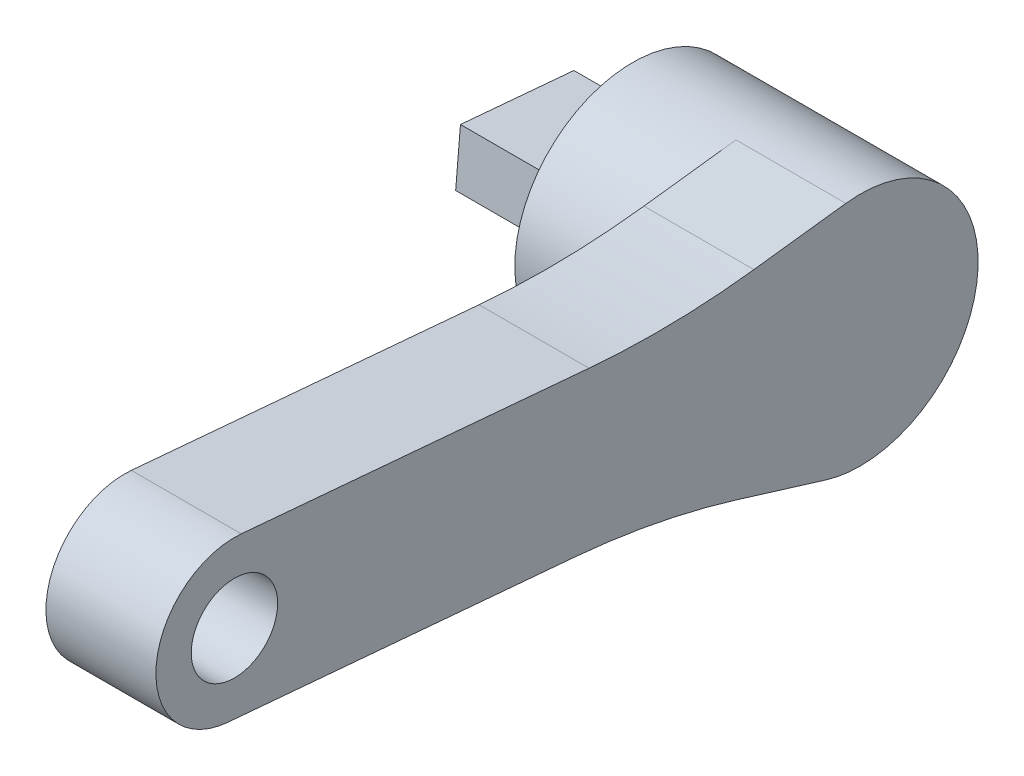
ISO-10303-21;
HEADER;
FILE_DESCRIPTION(('STEP AP214'),'2;1');
FILE_NAME('part.step','',(''),(''),'','','');
FILE_SCHEMA(('AUTOMOTIVE_DESIGN { 1 0 10303 214 1 1 1 1 }'));
ENDSEC;
DATA;
#1=APPLICATION_CONTEXT('core data for automotive mechanical design processes');
#2=APPLICATION_PROTOCOL_DEFINITION('international standard','automotive_design',2000,#1);
#3=PRODUCT_CONTEXT('',#1,'mechanical');
#4=PRODUCT('Part','Part','',(#3));
#5=PRODUCT_RELATED_PRODUCT_CATEGORY('part','',(#4));
#6=PRODUCT_DEFINITION_FORMATION('','',#4);
#7=PRODUCT_DEFINITION_CONTEXT('part definition',#1,'design');
#8=PRODUCT_DEFINITION('design','',#6,#7);
#9=PRODUCT_DEFINITION_SHAPE('','',#8);
#10=(LENGTH_UNIT() NAMED_UNIT(*) SI_UNIT(.MILLI.,.METRE.));
#11=(NAMED_UNIT(*) PLANE_ANGLE_UNIT() SI_UNIT($,.RADIAN.));
#12=(NAMED_UNIT(*) SI_UNIT($,.STERADIAN.) SOLID_ANGLE_UNIT());
#13=UNCERTAINTY_MEASURE_WITH_UNIT(LENGTH_MEASURE(1.E-05),#10,'distance_accuracy_value','');
#14=(GEOMETRIC_REPRESENTATION_CONTEXT(3) GLOBAL_UNCERTAINTY_ASSIGNED_CONTEXT((#13)) GLOBAL_UNIT_ASSIGNED_CONTEXT((#10,
#11,#12)) REPRESENTATION_CONTEXT('',''));
#15=CARTESIAN_POINT('',(0.,0.,0.));
#16=DIRECTION('',(0.,0.,1.));
#17=DIRECTION('',(1.,0.,0.));
#18=AXIS2_PLACEMENT_3D('',#15,#16,#17);
#19=CARTESIAN_POINT('',(17.,-57.9290572909012,5.01653247030481));
#20=DIRECTION('',(-1.,0.,0.));
#21=DIRECTION('',(0.,0.,1.));
#22=AXIS2_PLACEMENT_3D('',#19,#20,#21);
#23=PLANE('',#22);
#24=CARTESIAN_POINT('',(17.,-56.5345654069388,20.9556476397727));
#25=DIRECTION('',(-1.,0.,0.));
#26=DIRECTION('',(0.,0.,1.));
#27=AXIS2_PLACEMENT_3D('',#24,#25,#26);
#28=CIRCLE('',#27,1.09999999999999);
#29=CARTESIAN_POINT('',(17.,-56.5345654069388,22.0556476397727));
#30=VERTEX_POINT('',#29);
#31=EDGE_CURVE('E314',#30,#30,#28,.T.);
#32=ORIENTED_EDGE('',*,*,#31,.F.);
#33=EDGE_LOOP('',(#32));
#34=FACE_BOUND('',#33,.T.);
#35=CARTESIAN_POINT('',(17.,-57.9290572909012,5.01653247030481));
#36=DIRECTION('',(-1.,0.,0.));
#37=DIRECTION('',(0.,0.,1.));
#38=AXIS2_PLACEMENT_3D('',#35,#36,#37);
#39=CIRCLE('',#38,2.99999999999923);
#40=CARTESIAN_POINT('',(17.,-60.7971573612365,5.89630629723257));
#41=VERTEX_POINT('',#40);
#42=CARTESIAN_POINT('',(17.,-54.9517589834166,5.38490020538022));
#43=VERTEX_POINT('',#42);
#44=EDGE_CURVE('E12',#41,#43,#39,.T.);
#45=ORIENTED_EDGE('',*,*,#44,.F.);
#46=DIRECTION('',(0.,-0.293257942309178,-0.956033356778197));
#47=VECTOR('',#46,1.);
#48=CARTESIAN_POINT('',(17.,-59.4856679733464,10.1718174462596));
#49=LINE('',#48,#47);
#50=CARTESIAN_POINT('',(17.,-60.1048692679701,8.15319490680121));
#51=VERTEX_POINT('',#50);
#52=EDGE_CURVE('E166',#51,#41,#49,.T.);
#53=ORIENTED_EDGE('',*,*,#52,.F.);
#54=CARTESIAN_POINT('',(17.,-79.225536403534,14.0183537529848));
#55=DIRECTION('',(-1.,0.,0.));
#56=DIRECTION('',(0.,0.,1.));
#57=AXIS2_PLACEMENT_3D('',#54,#55,#56);
#58=CIRCLE('',#57,20.);
#59=CARTESIAN_POINT('',(17.,-59.3016424416991,12.2752388980318));
#60=VERTEX_POINT('',#59);
#61=EDGE_CURVE('E52',#51,#60,#58,.F.);
#62=ORIENTED_EDGE('',*,*,#61,.T.);
#63=DIRECTION('',(0.,-0.0871557427476503,-0.996194698091746));
#64=VECTOR('',#63,1.);
#65=CARTESIAN_POINT('',(17.,-59.4856679733464,10.1718174462596));
#66=LINE('',#65,#64);
#67=CARTESIAN_POINT('',(17.,-58.5269548031223,21.1299591252681));
#68=VERTEX_POINT('',#67);
#69=EDGE_CURVE('E182',#68,#60,#66,.T.);
#70=ORIENTED_EDGE('',*,*,#69,.F.);
#71=CARTESIAN_POINT('',(17.,-56.5345654069388,20.9556476397727));
#72=DIRECTION('',(-1.,0.,0.));
#73=DIRECTION('',(0.,0.,1.));
#74=AXIS2_PLACEMENT_3D('',#71,#72,#73);
#75=CIRCLE('',#74,2.00000000000001);
#76=CARTESIAN_POINT('',(17.,-54.5421760107553,20.7813361542774));
#77=VERTEX_POINT('',#76);
#78=EDGE_CURVE('E187',#77,#68,#75,.F.);
#79=ORIENTED_EDGE('',*,*,#78,.F.);
#80=DIRECTION('',(0.,0.0871557427476509,0.996194698091746));
#81=VECTOR('',#80,1.);
#82=CARTESIAN_POINT('',(17.,-54.5421760107553,20.7813361542774));
#83=LINE('',#82,#81);
#84=CARTESIAN_POINT('',(17.,-55.3168636493321,11.9266159270411));
#85=VERTEX_POINT('',#84);
#86=EDGE_CURVE('E191',#85,#77,#83,.T.);
#87=ORIENTED_EDGE('',*,*,#86,.F.);
#88=CARTESIAN_POINT('',(17.,-35.3929696874971,10.1835010720881));
#89=DIRECTION('',(-1.,0.,0.));
#90=DIRECTION('',(0.,0.,1.));
#91=AXIS2_PLACEMENT_3D('',#88,#89,#90);
#92=CIRCLE('',#91,20.);
#93=CARTESIAN_POINT('',(17.,-55.2416250707331,7.72771617158475));
#94=VERTEX_POINT('',#93);
#95=EDGE_CURVE('E214',#85,#94,#92,.F.);
#96=ORIENTED_EDGE('',*,*,#95,.T.);
#97=DIRECTION('',(0.,-0.122789245025168,0.992432769161795));
#98=VECTOR('',#97,1.);
#99=CARTESIAN_POINT('',(17.,-55.5008891809794,9.82319447526902));
#100=LINE('',#99,#98);
#101=EDGE_CURVE('E193',#43,#94,#100,.T.);
#102=ORIENTED_EDGE('',*,*,#101,.F.);
#103=EDGE_LOOP('',(#45,#53,#62,#70,#79,#87,#96,#102));
#104=FACE_BOUND('',#103,.T.);
#105=ADVANCED_FACE('F43',(#34,#104),#23,.T.);
#106=CARTESIAN_POINT('',(19.8,-56.5345654069388,20.9556476397727));
#107=DIRECTION('',(1.,0.,0.));
#108=DIRECTION('',(0.,0.,-1.));
#109=AXIS2_PLACEMENT_3D('',#106,#107,#108);
#110=PLANE('',#109);
#111=CARTESIAN_POINT('',(19.8,-56.5345654069388,20.9556476397727));
#112=DIRECTION('',(1.,0.,0.));
#113=DIRECTION('',(0.,0.,-1.));
#114=AXIS2_PLACEMENT_3D('',#111,#112,#113);
#115=CIRCLE('',#114,1.09999999999999);
#116=CARTESIAN_POINT('',(19.8,-56.5345654069388,19.8556476397728));
#117=VERTEX_POINT('',#116);
#118=EDGE_CURVE('E47',#117,#117,#115,.T.);
#119=ORIENTED_EDGE('',*,*,#118,.F.);
#120=EDGE_LOOP('',(#119));
#121=FACE_BOUND('',#120,.T.);
#122=DIRECTION('',(0.,-0.0871557427476503,-0.996194698091746));
#123=VECTOR('',#122,1.);
#124=CARTESIAN_POINT('',(19.8,-59.4856679733464,10.1718174462596));
#125=LINE('',#124,#123);
#126=CARTESIAN_POINT('',(19.8,-58.5269548031223,21.1299591252681));
#127=VERTEX_POINT('',#126);
#128=CARTESIAN_POINT('',(19.8,-59.3016424416991,12.2752388980318));
#129=VERTEX_POINT('',#128);
#130=EDGE_CURVE('E157',#127,#129,#125,.T.);
#131=ORIENTED_EDGE('',*,*,#130,.T.);
#132=CARTESIAN_POINT('',(19.8,-79.225536403534,14.0183537529848));
#133=DIRECTION('',(1.,0.,0.));
#134=DIRECTION('',(0.,0.,-1.));
#135=AXIS2_PLACEMENT_3D('',#132,#133,#134);
#136=CIRCLE('',#135,20.);
#137=CARTESIAN_POINT('',(19.8,-60.1048692679701,8.15319490680122));
#138=VERTEX_POINT('',#137);
#139=EDGE_CURVE('E216',#129,#138,#136,.F.);
#140=ORIENTED_EDGE('',*,*,#139,.T.);
#141=DIRECTION('',(0.,-0.293257942309178,-0.956033356778197));
#142=VECTOR('',#141,1.);
#143=CARTESIAN_POINT('',(19.8,-59.4856679733464,10.1718174462596));
#144=LINE('',#143,#142);
#145=CARTESIAN_POINT('',(19.8,-60.7971573612365,5.89630629723257));
#146=VERTEX_POINT('',#145);
#147=EDGE_CURVE('E175',#138,#146,#144,.T.);
#148=ORIENTED_EDGE('',*,*,#147,.T.);
#149=CARTESIAN_POINT('',(19.8,-57.9290572909012,5.01653247030481));
#150=DIRECTION('',(1.,0.,0.));
#151=DIRECTION('',(0.,0.,-1.));
#152=AXIS2_PLACEMENT_3D('',#149,#150,#151);
#153=CIRCLE('',#152,3.00000000000079);
#154=CARTESIAN_POINT('',(19.8,-54.951758983415,5.38490020538041));
#155=VERTEX_POINT('',#154);
#156=EDGE_CURVE('E172',#146,#155,#153,.T.);
#157=ORIENTED_EDGE('',*,*,#156,.T.);
#158=DIRECTION('',(0.,-0.122789245025168,0.992432769161795));
#159=VECTOR('',#158,1.);
#160=CARTESIAN_POINT('',(19.8,-55.5008891809794,9.82319447526902));
#161=LINE('',#160,#159);
#162=CARTESIAN_POINT('',(19.8,-55.2416250707331,7.72771617158475));
#163=VERTEX_POINT('',#162);
#164=EDGE_CURVE('E169',#155,#163,#161,.T.);
#165=ORIENTED_EDGE('',*,*,#164,.T.);
#166=CARTESIAN_POINT('',(19.8,-35.3929696874971,10.1835010720881));
#167=DIRECTION('',(1.,0.,0.));
#168=DIRECTION('',(0.,0.,-1.));
#169=AXIS2_PLACEMENT_3D('',#166,#167,#168);
#170=CIRCLE('',#169,20.);
#171=CARTESIAN_POINT('',(19.8,-55.3168636493321,11.9266159270411));
#172=VERTEX_POINT('',#171);
#173=EDGE_CURVE('E212',#163,#172,#170,.F.);
#174=ORIENTED_EDGE('',*,*,#173,.T.);
#175=DIRECTION('',(0.,0.0871557427476509,0.996194698091746));
#176=VECTOR('',#175,1.);
#177=CARTESIAN_POINT('',(19.8,-54.5421760107553,20.7813361542774));
#178=LINE('',#177,#176);
#179=CARTESIAN_POINT('',(19.8,-54.5421760107553,20.7813361542774));
#180=VERTEX_POINT('',#179);
#181=EDGE_CURVE('E167',#172,#180,#178,.T.);
#182=ORIENTED_EDGE('',*,*,#181,.T.);
#183=CARTESIAN_POINT('',(19.8,-56.5345654069388,20.9556476397727));
#184=DIRECTION('',(1.,0.,0.));
#185=DIRECTION('',(0.,0.,-1.));
#186=AXIS2_PLACEMENT_3D('',#183,#184,#185);
#187=CIRCLE('',#186,2.00000000000001);
#188=EDGE_CURVE('E163',#180,#127,#187,.T.);
#189=ORIENTED_EDGE('',*,*,#188,.T.);
#190=EDGE_LOOP('',(#131,#140,#148,#157,#165,#174,#182,#189));
#191=FACE_BOUND('',#190,.T.);
#192=ADVANCED_FACE('F230',(#121,#191),#110,.T.);
#193=CARTESIAN_POINT('',(-4.99374500934792,-59.4856679733464,10.1718174462596));
#194=DIRECTION('',(0.,-0.956033356778197,0.293257942309178));
#195=DIRECTION('',(0.,-0.293257942309178,-0.956033356778197));
#196=AXIS2_PLACEMENT_3D('',#193,#194,#195);
#197=PLANE('',#196);
#198=ORIENTED_EDGE('',*,*,#147,.F.);
#199=DIRECTION('',(1.,0.,0.));
#200=VECTOR('',#199,1.);
#201=CARTESIAN_POINT('',(17.,-60.1048692679701,8.15319490680121));
#202=LINE('',#201,#200);
#203=EDGE_CURVE('E210',#138,#51,#202,.F.);
#204=ORIENTED_EDGE('',*,*,#203,.T.);
#205=ORIENTED_EDGE('',*,*,#52,.T.);
#206=DIRECTION('',(1.,0.,0.));
#207=VECTOR('',#206,1.);
#208=CARTESIAN_POINT('',(-4.99374500934792,-60.7971573612365,5.89630629723257));
#209=LINE('',#208,#207);
#210=EDGE_CURVE('E181',#41,#146,#209,.T.);
#211=ORIENTED_EDGE('',*,*,#210,.T.);
#212=EDGE_LOOP('',(#198,#204,#205,#211));
#213=FACE_BOUND('',#212,.T.);
#214=ADVANCED_FACE('F232',(#213),#197,.T.);
#215=CARTESIAN_POINT('',(-4.99374500934792,-57.9290572909012,5.01653247030481));
#216=DIRECTION('',(1.,0.,0.));
#217=DIRECTION('',(0.,0.,-1.));
#218=AXIS2_PLACEMENT_3D('',#215,#216,#217);
#219=CYLINDRICAL_SURFACE('',#218,3.00000000000079);
#220=ORIENTED_EDGE('',*,*,#210,.F.);
#221=ORIENTED_EDGE('',*,*,#44,.T.);
#222=DIRECTION('',(1.,0.,0.));
#223=VECTOR('',#222,1.);
#224=CARTESIAN_POINT('',(-4.99374500934792,-54.951758983415,5.38490020538041));
#225=LINE('',#224,#223);
#226=EDGE_CURVE('E196',#43,#155,#225,.T.);
#227=ORIENTED_EDGE('',*,*,#226,.T.);
#228=ORIENTED_EDGE('',*,*,#156,.F.);
#229=EDGE_LOOP('',(#220,#221,#227,#228));
#230=FACE_BOUND('',#229,.T.);
#231=CARTESIAN_POINT('',(14.,-57.9290572909012,5.01653247030481));
#232=DIRECTION('',(-1.,0.,0.));
#233=DIRECTION('',(0.,-1.,0.));
#234=AXIS2_PLACEMENT_3D('',#231,#232,#233);
#235=CIRCLE('',#234,2.99999999999923);
#236=CARTESIAN_POINT('',(14.,-60.9290572909004,5.01653247030481));
#237=VERTEX_POINT('',#236);
#238=EDGE_CURVE('E154',#237,#237,#235,.T.);
#239=ORIENTED_EDGE('',*,*,#238,.F.);
#240=EDGE_LOOP('',(#239));
#241=FACE_BOUND('',#240,.T.);
#242=ADVANCED_FACE('F236',(#230,#241),#219,.T.);
#243=CARTESIAN_POINT('',(-4.99374500934792,-55.5008891809794,9.82319447526902));
#244=DIRECTION('',(0.,0.992432769161795,0.122789245025168));
#245=DIRECTION('',(0.,-0.122789245025168,0.992432769161795));
#246=AXIS2_PLACEMENT_3D('',#243,#244,#245);
#247=PLANE('',#246);
#248=ORIENTED_EDGE('',*,*,#101,.T.);
#249=DIRECTION('',(1.,0.,0.));
#250=VECTOR('',#249,1.);
#251=CARTESIAN_POINT('',(19.8,-55.2416250707331,7.72771617158475));
#252=LINE('',#251,#250);
#253=EDGE_CURVE('E185',#94,#163,#252,.T.);
#254=ORIENTED_EDGE('',*,*,#253,.T.);
#255=ORIENTED_EDGE('',*,*,#164,.F.);
#256=ORIENTED_EDGE('',*,*,#226,.F.);
#257=EDGE_LOOP('',(#248,#254,#255,#256));
#258=FACE_BOUND('',#257,.T.);
#259=ADVANCED_FACE('F241',(#258),#247,.T.);
#260=CARTESIAN_POINT('',(-4.99374500934792,-54.5421760107553,20.7813361542774));
#261=DIRECTION('',(0.,0.996194698091746,-0.0871557427476509));
#262=DIRECTION('',(0.,0.0871557427476509,0.996194698091746));
#263=AXIS2_PLACEMENT_3D('',#260,#261,#262);
#264=PLANE('',#263);
#265=ORIENTED_EDGE('',*,*,#181,.F.);
#266=DIRECTION('',(1.,0.,0.));
#267=VECTOR('',#266,1.);
#268=CARTESIAN_POINT('',(17.,-55.3168636493321,11.9266159270411));
#269=LINE('',#268,#267);
#270=EDGE_CURVE('E205',#172,#85,#269,.F.);
#271=ORIENTED_EDGE('',*,*,#270,.T.);
#272=ORIENTED_EDGE('',*,*,#86,.T.);
#273=DIRECTION('',(1.,0.,0.));
#274=VECTOR('',#273,1.);
#275=CARTESIAN_POINT('',(-4.99374500934792,-54.5421760107553,20.7813361542774));
#276=LINE('',#275,#274);
#277=EDGE_CURVE('E190',#77,#180,#276,.T.);
#278=ORIENTED_EDGE('',*,*,#277,.T.);
#279=EDGE_LOOP('',(#265,#271,#272,#278));
#280=FACE_BOUND('',#279,.T.);
#281=ADVANCED_FACE('F250',(#280),#264,.T.);
#282=CARTESIAN_POINT('',(-4.99374500934792,-56.5345654069388,20.9556476397727));
#283=DIRECTION('',(1.,0.,0.));
#284=DIRECTION('',(0.,0.,-1.));
#285=AXIS2_PLACEMENT_3D('',#282,#283,#284);
#286=CYLINDRICAL_SURFACE('',#285,2.00000000000001);
#287=ORIENTED_EDGE('',*,*,#277,.F.);
#288=ORIENTED_EDGE('',*,*,#78,.T.);
#289=DIRECTION('',(1.,0.,0.));
#290=VECTOR('',#289,1.);
#291=CARTESIAN_POINT('',(-4.99374500934792,-58.5269548031223,21.1299591252681));
#292=LINE('',#291,#290);
#293=EDGE_CURVE('E186',#68,#127,#292,.T.);
#294=ORIENTED_EDGE('',*,*,#293,.T.);
#295=ORIENTED_EDGE('',*,*,#188,.F.);
#296=EDGE_LOOP('',(#287,#288,#294,#295));
#297=FACE_BOUND('',#296,.T.);
#298=ADVANCED_FACE('F254',(#297),#286,.T.);
#299=CARTESIAN_POINT('',(-4.99374500934792,-59.4856679733464,10.1718174462596));
#300=DIRECTION('',(0.,-0.996194698091746,0.0871557427476503));
#301=DIRECTION('',(0.,-0.0871557427476503,-0.996194698091746));
#302=AXIS2_PLACEMENT_3D('',#299,#300,#301);
#303=PLANE('',#302);
#304=ORIENTED_EDGE('',*,*,#69,.T.);
#305=DIRECTION('',(1.,0.,0.));
#306=VECTOR('',#305,1.);
#307=CARTESIAN_POINT('',(19.8,-59.3016424416991,12.2752388980318));
#308=LINE('',#307,#306);
#309=EDGE_CURVE('E207',#60,#129,#308,.T.);
#310=ORIENTED_EDGE('',*,*,#309,.T.);
#311=ORIENTED_EDGE('',*,*,#130,.F.);
#312=ORIENTED_EDGE('',*,*,#293,.F.);
#313=EDGE_LOOP('',(#304,#310,#311,#312));
#314=FACE_BOUND('',#313,.T.);
#315=ADVANCED_FACE('F226',(#314),#303,.T.);
#316=CARTESIAN_POINT('',(-4.99374500934792,-35.3929696874971,10.1835010720881));
#317=DIRECTION('',(-1.,0.,0.));
#318=DIRECTION('',(0.,0.,1.));
#319=AXIS2_PLACEMENT_3D('',#316,#317,#318);
#320=CYLINDRICAL_SURFACE('',#319,20.);
#321=ORIENTED_EDGE('',*,*,#95,.F.);
#322=ORIENTED_EDGE('',*,*,#270,.F.);
#323=ORIENTED_EDGE('',*,*,#173,.F.);
#324=ORIENTED_EDGE('',*,*,#253,.F.);
#325=EDGE_LOOP('',(#321,#322,#323,#324));
#326=FACE_BOUND('',#325,.T.);
#327=ADVANCED_FACE('F246',(#326),#320,.F.);
#328=CARTESIAN_POINT('',(-4.99374500934792,-79.225536403534,14.0183537529848));
#329=DIRECTION('',(-1.,0.,0.));
#330=DIRECTION('',(0.,0.,1.));
#331=AXIS2_PLACEMENT_3D('',#328,#329,#330);
#332=CYLINDRICAL_SURFACE('',#331,20.);
#333=ORIENTED_EDGE('',*,*,#61,.F.);
#334=ORIENTED_EDGE('',*,*,#203,.F.);
#335=ORIENTED_EDGE('',*,*,#139,.F.);
#336=ORIENTED_EDGE('',*,*,#309,.F.);
#337=EDGE_LOOP('',(#333,#334,#335,#336));
#338=FACE_BOUND('',#337,.T.);
#339=ADVANCED_FACE('F45',(#338),#332,.F.);
#340=CARTESIAN_POINT('',(14.,-52.2127503886378,-21.4354866235499));
#341=DIRECTION('',(-1.,0.,0.));
#342=DIRECTION('',(0.,-1.,0.));
#343=AXIS2_PLACEMENT_3D('',#340,#341,#342);
#344=PLANE('',#343);
#345=DIRECTION('',(0.,-0.996194698091746,0.0871557427476506));
#346=VECTOR('',#345,1.);
#347=CARTESIAN_POINT('',(14.,-58.7527694065495,3.63305917799513));
#348=LINE('',#347,#346);
#349=CARTESIAN_POINT('',(14.,-57.3580968292211,3.51104113814842));
#350=VERTEX_POINT('',#349);
#351=CARTESIAN_POINT('',(14.,-58.7527694065495,3.63305917799513));
#352=VERTEX_POINT('',#351);
#353=EDGE_CURVE('E60',#350,#352,#348,.T.);
#354=ORIENTED_EDGE('',*,*,#353,.F.);
#355=DIRECTION('',(0.,-0.0871557427476509,-0.996194698091746));
#356=VECTOR('',#355,1.);
#357=CARTESIAN_POINT('',(14.,-57.3580968292211,3.51104113814842));
#358=LINE('',#357,#356);
#359=CARTESIAN_POINT('',(14.,-57.1053451752529,6.40000576261449));
#360=VERTEX_POINT('',#359);
#361=EDGE_CURVE('E64',#360,#350,#358,.T.);
#362=ORIENTED_EDGE('',*,*,#361,.F.);
#363=DIRECTION('',(0.,0.996194698091746,-0.0871557427476507));
#364=VECTOR('',#363,1.);
#365=CARTESIAN_POINT('',(14.,-57.1053451752529,6.40000576261449));
#366=LINE('',#365,#364);
#367=CARTESIAN_POINT('',(14.,-58.5000177525813,6.5220238024612));
#368=VERTEX_POINT('',#367);
#369=EDGE_CURVE('E325',#368,#360,#366,.T.);
#370=ORIENTED_EDGE('',*,*,#369,.F.);
#371=DIRECTION('',(0.,0.0871557427476533,0.996194698091746));
#372=VECTOR('',#371,1.);
#373=CARTESIAN_POINT('',(14.,-58.5000177525813,6.5220238024612));
#374=LINE('',#373,#372);
#375=EDGE_CURVE('E318',#352,#368,#374,.T.);
#376=ORIENTED_EDGE('',*,*,#375,.F.);
#377=EDGE_LOOP('',(#354,#362,#370,#376));
#378=FACE_BOUND('',#377,.T.);
#379=ORIENTED_EDGE('',*,*,#238,.T.);
#380=EDGE_LOOP('',(#379));
#381=FACE_BOUND('',#380,.T.);
#382=ADVANCED_FACE('F281',(#378,#381),#344,.T.);
#383=CARTESIAN_POINT('',(11.,-58.7527694065495,3.63305917799513));
#384=DIRECTION('',(0.,0.0871557427476506,0.996194698091746));
#385=DIRECTION('',(0.,-0.996194698091746,0.0871557427476506));
#386=AXIS2_PLACEMENT_3D('',#383,#384,#385);
#387=PLANE('',#386);
#388=ORIENTED_EDGE('',*,*,#353,.T.);
#389=DIRECTION('',(1.,0.,0.));
#390=VECTOR('',#389,1.);
#391=CARTESIAN_POINT('',(11.,-58.7527694065495,3.63305917799513));
#392=LINE('',#391,#390);
#393=CARTESIAN_POINT('',(11.,-58.7527694065495,3.63305917799513));
#394=VERTEX_POINT('',#393);
#395=EDGE_CURVE('E137',#394,#352,#392,.T.);
#396=ORIENTED_EDGE('',*,*,#395,.F.);
#397=DIRECTION('',(0.,-0.996194698091746,0.0871557427476506));
#398=VECTOR('',#397,1.);
#399=CARTESIAN_POINT('',(11.,-58.7527694065495,3.63305917799513));
#400=LINE('',#399,#398);
#401=CARTESIAN_POINT('',(11.,-57.3580968292211,3.51104113814842));
#402=VERTEX_POINT('',#401);
#403=EDGE_CURVE('E143',#402,#394,#400,.T.);
#404=ORIENTED_EDGE('',*,*,#403,.F.);
#405=DIRECTION('',(1.,0.,0.));
#406=VECTOR('',#405,1.);
#407=CARTESIAN_POINT('',(11.,-57.3580968292211,3.51104113814842));
#408=LINE('',#407,#406);
#409=EDGE_CURVE('E322',#402,#350,#408,.T.);
#410=ORIENTED_EDGE('',*,*,#409,.T.);
#411=EDGE_LOOP('',(#388,#396,#404,#410));
#412=FACE_BOUND('',#411,.T.);
#413=ADVANCED_FACE('F153',(#412),#387,.F.);
#414=CARTESIAN_POINT('',(11.,-58.5000177525813,6.5220238024612));
#415=DIRECTION('',(0.,0.996194698091746,-0.0871557427476533));
#416=DIRECTION('',(0.,0.0871557427476533,0.996194698091746));
#417=AXIS2_PLACEMENT_3D('',#414,#415,#416);
#418=PLANE('',#417);
#419=ORIENTED_EDGE('',*,*,#375,.T.);
#420=DIRECTION('',(1.,0.,0.));
#421=VECTOR('',#420,1.);
#422=CARTESIAN_POINT('',(11.,-58.5000177525813,6.5220238024612));
#423=LINE('',#422,#421);
#424=CARTESIAN_POINT('',(11.,-58.5000177525813,6.5220238024612));
#425=VERTEX_POINT('',#424);
#426=EDGE_CURVE('E139',#425,#368,#423,.T.);
#427=ORIENTED_EDGE('',*,*,#426,.F.);
#428=DIRECTION('',(0.,0.0871557427476533,0.996194698091746));
#429=VECTOR('',#428,1.);
#430=CARTESIAN_POINT('',(11.,-58.5000177525813,6.5220238024612));
#431=LINE('',#430,#429);
#432=EDGE_CURVE('E132',#394,#425,#431,.T.);
#433=ORIENTED_EDGE('',*,*,#432,.F.);
#434=ORIENTED_EDGE('',*,*,#395,.T.);
#435=EDGE_LOOP('',(#419,#427,#433,#434));
#436=FACE_BOUND('',#435,.T.);
#437=ADVANCED_FACE('F135',(#436),#418,.F.);
#438=CARTESIAN_POINT('',(11.,-57.1053451752529,6.40000576261449));
#439=DIRECTION('',(0.,-0.0871557427476507,-0.996194698091746));
#440=DIRECTION('',(0.,0.996194698091746,-0.0871557427476508));
#441=AXIS2_PLACEMENT_3D('',#438,#439,#440);
#442=PLANE('',#441);
#443=ORIENTED_EDGE('',*,*,#369,.T.);
#444=DIRECTION('',(1.,0.,0.));
#445=VECTOR('',#444,1.);
#446=CARTESIAN_POINT('',(11.,-57.1053451752529,6.40000576261449));
#447=LINE('',#446,#445);
#448=CARTESIAN_POINT('',(11.,-57.1053451752529,6.40000576261449));
#449=VERTEX_POINT('',#448);
#450=EDGE_CURVE('E159',#449,#360,#447,.T.);
#451=ORIENTED_EDGE('',*,*,#450,.F.);
#452=DIRECTION('',(0.,0.996194698091746,-0.0871557427476507));
#453=VECTOR('',#452,1.);
#454=CARTESIAN_POINT('',(11.,-57.1053451752529,6.40000576261449));
#455=LINE('',#454,#453);
#456=EDGE_CURVE('E142',#425,#449,#455,.T.);
#457=ORIENTED_EDGE('',*,*,#456,.F.);
#458=ORIENTED_EDGE('',*,*,#426,.T.);
#459=EDGE_LOOP('',(#443,#451,#457,#458));
#460=FACE_BOUND('',#459,.T.);
#461=ADVANCED_FACE('F296',(#460),#442,.F.);
#462=CARTESIAN_POINT('',(11.,-57.3580968292211,3.51104113814842));
#463=DIRECTION('',(0.,-0.996194698091746,0.0871557427476509));
#464=DIRECTION('',(0.,-0.0871557427476509,-0.996194698091746));
#465=AXIS2_PLACEMENT_3D('',#462,#463,#464);
#466=PLANE('',#465);
#467=ORIENTED_EDGE('',*,*,#361,.T.);
#468=ORIENTED_EDGE('',*,*,#409,.F.);
#469=DIRECTION('',(0.,-0.0871557427476509,-0.996194698091746));
#470=VECTOR('',#469,1.);
#471=CARTESIAN_POINT('',(11.,-57.3580968292211,3.51104113814842));
#472=LINE('',#471,#470);
#473=EDGE_CURVE('E148',#449,#402,#472,.T.);
#474=ORIENTED_EDGE('',*,*,#473,.F.);
#475=ORIENTED_EDGE('',*,*,#450,.T.);
#476=EDGE_LOOP('',(#467,#468,#474,#475));
#477=FACE_BOUND('',#476,.T.);
#478=ADVANCED_FACE('F299',(#477),#466,.F.);
#479=CARTESIAN_POINT('',(11.,0.,0.));
#480=DIRECTION('',(1.,0.,0.));
#481=DIRECTION('',(0.,0.,-1.));
#482=AXIS2_PLACEMENT_3D('',#479,#480,#481);
#483=PLANE('',#482);
#484=ORIENTED_EDGE('',*,*,#403,.T.);
#485=ORIENTED_EDGE('',*,*,#432,.T.);
#486=ORIENTED_EDGE('',*,*,#456,.T.);
#487=ORIENTED_EDGE('',*,*,#473,.T.);
#488=EDGE_LOOP('',(#484,#485,#486,#487));
#489=FACE_BOUND('',#488,.T.);
#490=ADVANCED_FACE('F146',(#489),#483,.F.);
#491=CARTESIAN_POINT('',(13.,-56.5345654069388,20.9556476397727));
#492=DIRECTION('',(-1.,0.,0.));
#493=DIRECTION('',(0.,0.,1.));
#494=AXIS2_PLACEMENT_3D('',#491,#492,#493);
#495=CYLINDRICAL_SURFACE('',#494,1.09999999999999);
#496=ORIENTED_EDGE('',*,*,#31,.T.);
#497=EDGE_LOOP('',(#496));
#498=FACE_BOUND('',#497,.T.);
#499=ORIENTED_EDGE('',*,*,#118,.T.);
#500=EDGE_LOOP('',(#499));
#501=FACE_BOUND('',#500,.T.);
#502=ADVANCED_FACE('F306',(#498,#501),#495,.F.);
#503=CLOSED_SHELL('',(#105,#192,#214,#242,#259,#281,#298,#315,#327,#339,#382,#413,#437,#461,
#478,#490,#502));
#504=MANIFOLD_SOLID_BREP('B2',#503);
#505=ADVANCED_BREP_SHAPE_REPRESENTATION('',(#18,#504),#14);
#506=SHAPE_DEFINITION_REPRESENTATION(#9,#505);
ENDSEC;
END-ISO-10303-21;
